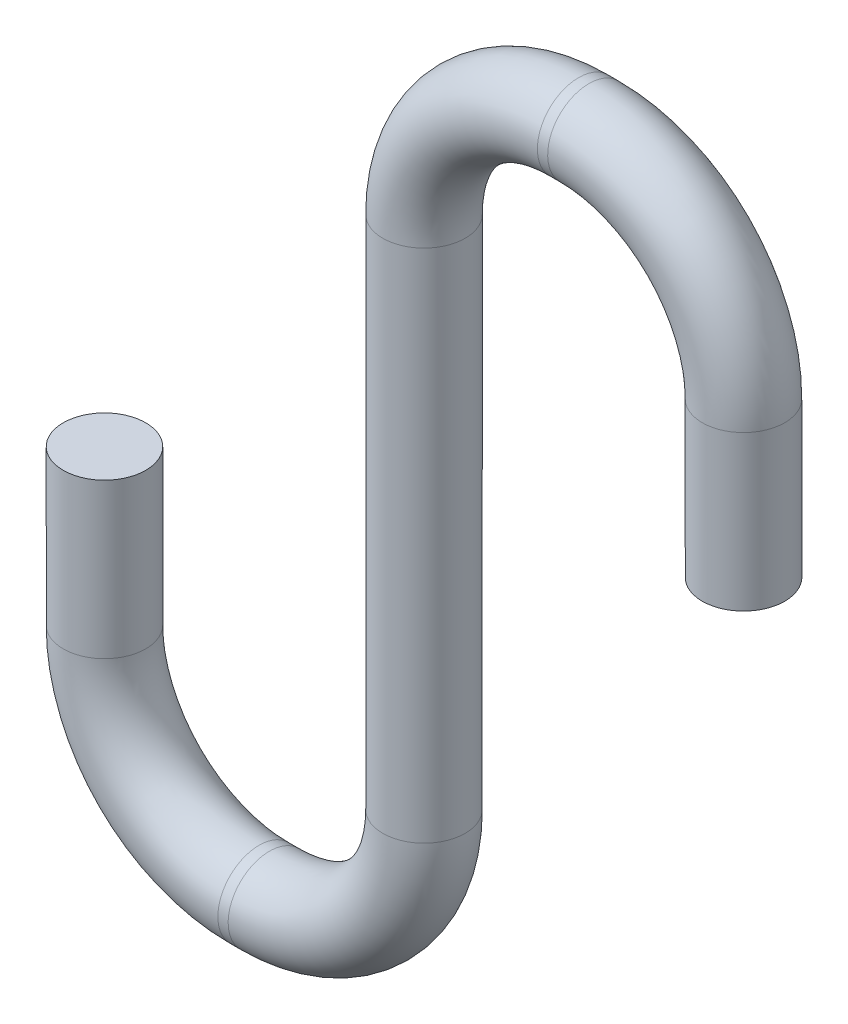
ISO-10303-21;
HEADER;
FILE_DESCRIPTION(('STEP AP214'),'2;1');
FILE_NAME('part.step','',(''),(''),'','','');
FILE_SCHEMA(('AUTOMOTIVE_DESIGN { 1 0 10303 214 1 1 1 1 }'));
ENDSEC;
DATA;
#1=APPLICATION_CONTEXT('core data for automotive mechanical design processes');
#2=APPLICATION_PROTOCOL_DEFINITION('international standard','automotive_design',2000,#1);
#3=PRODUCT_CONTEXT('',#1,'mechanical');
#4=PRODUCT('Part','Part','',(#3));
#5=PRODUCT_RELATED_PRODUCT_CATEGORY('part','',(#4));
#6=PRODUCT_DEFINITION_FORMATION('','',#4);
#7=PRODUCT_DEFINITION_CONTEXT('part definition',#1,'design');
#8=PRODUCT_DEFINITION('design','',#6,#7);
#9=PRODUCT_DEFINITION_SHAPE('','',#8);
#10=(LENGTH_UNIT() NAMED_UNIT(*) SI_UNIT(.MILLI.,.METRE.));
#11=(NAMED_UNIT(*) PLANE_ANGLE_UNIT() SI_UNIT($,.RADIAN.));
#12=(NAMED_UNIT(*) SI_UNIT($,.STERADIAN.) SOLID_ANGLE_UNIT());
#13=UNCERTAINTY_MEASURE_WITH_UNIT(LENGTH_MEASURE(1.E-05),#10,'distance_accuracy_value','');
#14=(GEOMETRIC_REPRESENTATION_CONTEXT(3) GLOBAL_UNCERTAINTY_ASSIGNED_CONTEXT((#13)) GLOBAL_UNIT_ASSIGNED_CONTEXT((#10,
#11,#12)) REPRESENTATION_CONTEXT('',''));
#15=CARTESIAN_POINT('',(0.,0.,0.));
#16=DIRECTION('',(0.,0.,1.));
#17=DIRECTION('',(1.,0.,0.));
#18=AXIS2_PLACEMENT_3D('',#15,#16,#17);
#19=CARTESIAN_POINT('',(-51.6919302261063,-13.8913857677903,0.));
#20=DIRECTION('',(0.,1.,0.));
#21=DIRECTION('',(0.,0.,1.));
#22=AXIS2_PLACEMENT_3D('',#19,#20,#21);
#23=PLANE('',#22);
#24=CARTESIAN_POINT('',(-51.6919302261063,-13.8913857677903,0.));
#25=DIRECTION('',(0.,1.,0.));
#26=DIRECTION('',(0.,0.,1.));
#27=AXIS2_PLACEMENT_3D('',#24,#25,#26);
#28=CIRCLE('',#27,4.);
#29=CARTESIAN_POINT('',(-51.6919302261063,-13.8913857677903,4.));
#30=VERTEX_POINT('',#29);
#31=EDGE_CURVE('E82',#30,#30,#28,.T.);
#32=ORIENTED_EDGE('',*,*,#31,.T.);
#33=EDGE_LOOP('',(#32));
#34=FACE_BOUND('',#33,.T.);
#35=ADVANCED_FACE('F39',(#34),#23,.T.);
#36=CARTESIAN_POINT('',(10.3080697738937,6.10861423220971,0.));
#37=DIRECTION('',(0.,1.,0.));
#38=DIRECTION('',(0.,0.,1.));
#39=AXIS2_PLACEMENT_3D('',#36,#37,#38);
#40=PLANE('',#39);
#41=CARTESIAN_POINT('',(10.3080697738937,6.10861423220971,0.));
#42=DIRECTION('',(0.,1.,0.));
#43=DIRECTION('',(0.,0.,1.));
#44=AXIS2_PLACEMENT_3D('',#41,#42,#43);
#45=CIRCLE('',#44,4.);
#46=CARTESIAN_POINT('',(10.3080697738937,6.10861423220971,4.));
#47=VERTEX_POINT('',#46);
#48=EDGE_CURVE('E10',#47,#47,#45,.T.);
#49=ORIENTED_EDGE('',*,*,#48,.F.);
#50=EDGE_LOOP('',(#49));
#51=FACE_BOUND('',#50,.T.);
#52=ADVANCED_FACE('F91',(#51),#40,.F.);
#53=CARTESIAN_POINT('',(-51.6919302261063,-13.8913857677903,0.));
#54=DIRECTION('',(0.,-1.,0.));
#55=DIRECTION('',(1.,0.,0.));
#56=AXIS2_PLACEMENT_3D('',#53,#54,#55);
#57=CYLINDRICAL_SURFACE('',#56,4.);
#58=CARTESIAN_POINT('',(-51.6919302261062,-28.8913857677903,0.));
#59=DIRECTION('',(0.,1.,0.));
#60=DIRECTION('',(0.,0.,1.));
#61=AXIS2_PLACEMENT_3D('',#58,#59,#60);
#62=CIRCLE('',#61,4.);
#63=CARTESIAN_POINT('',(-55.6919302261062,-28.8913857677903,0.));
#64=VERTEX_POINT('',#63);
#65=EDGE_CURVE('E78',#64,#64,#62,.T.);
#66=ORIENTED_EDGE('',*,*,#65,.T.);
#67=EDGE_LOOP('',(#66));
#68=FACE_BOUND('',#67,.T.);
#69=ORIENTED_EDGE('',*,*,#31,.F.);
#70=EDGE_LOOP('',(#69));
#71=FACE_BOUND('',#70,.T.);
#72=ADVANCED_FACE('F88',(#68,#71),#57,.T.);
#73=CARTESIAN_POINT('',(-36.6919302261063,-28.8913857677903,0.));
#74=DIRECTION('',(0.,0.,1.));
#75=DIRECTION('',(1.,0.,0.));
#76=AXIS2_PLACEMENT_3D('',#73,#74,#75);
#77=TOROIDAL_SURFACE('',#76,15.,4.);
#78=CARTESIAN_POINT('',(-36.6919302261062,-43.8913857677903,0.));
#79=DIRECTION('',(-1.,0.,0.));
#80=DIRECTION('',(0.,0.,1.));
#81=AXIS2_PLACEMENT_3D('',#78,#79,#80);
#82=CIRCLE('',#81,4.);
#83=CARTESIAN_POINT('',(-36.6919302261062,-47.8913857677903,0.));
#84=VERTEX_POINT('',#83);
#85=EDGE_CURVE('E74',#84,#84,#82,.T.);
#86=CARTESIAN_POINT('',(-36.6919302261063,-28.8913857677903,0.));
#87=DIRECTION('',(0.,0.,1.));
#88=DIRECTION('',(1.,0.,0.));
#89=AXIS2_PLACEMENT_3D('',#86,#87,#88);
#90=CIRCLE('',#89,19.);
#91=EDGE_CURVE('',#64,#84,#90,.T.);
#92=ORIENTED_EDGE('',*,*,#65,.F.);
#93=ORIENTED_EDGE('',*,*,#85,.T.);
#94=ORIENTED_EDGE('',*,*,#91,.T.);
#95=ORIENTED_EDGE('',*,*,#91,.F.);
#96=EDGE_LOOP('',(#92,#94,#93,#95));
#97=FACE_BOUND('',#96,.T.);
#98=ADVANCED_FACE('F90',(#97),#77,.T.);
#99=CARTESIAN_POINT('',(-36.6919302261063,-43.8913857677903,0.));
#100=DIRECTION('',(1.,0.,0.));
#101=DIRECTION('',(0.,1.,0.));
#102=AXIS2_PLACEMENT_3D('',#99,#100,#101);
#103=CYLINDRICAL_SURFACE('',#102,4.);
#104=CARTESIAN_POINT('',(-35.6919302261063,-43.8913857677903,0.));
#105=DIRECTION('',(-1.,0.,0.));
#106=DIRECTION('',(0.,0.,1.));
#107=AXIS2_PLACEMENT_3D('',#104,#105,#106);
#108=CIRCLE('',#107,4.);
#109=CARTESIAN_POINT('',(-35.6919302261063,-47.8913857677903,0.));
#110=VERTEX_POINT('',#109);
#111=EDGE_CURVE('E70',#110,#110,#108,.T.);
#112=ORIENTED_EDGE('',*,*,#111,.T.);
#113=EDGE_LOOP('',(#112));
#114=FACE_BOUND('',#113,.T.);
#115=ORIENTED_EDGE('',*,*,#85,.F.);
#116=EDGE_LOOP('',(#115));
#117=FACE_BOUND('',#116,.T.);
#118=ADVANCED_FACE('F98',(#114,#117),#103,.T.);
#119=CARTESIAN_POINT('',(-35.6919302261063,-28.8913857677903,0.));
#120=DIRECTION('',(0.,0.,1.));
#121=DIRECTION('',(1.,0.,0.));
#122=AXIS2_PLACEMENT_3D('',#119,#120,#121);
#123=TOROIDAL_SURFACE('',#122,15.,4.);
#124=CARTESIAN_POINT('',(-20.6919302261062,-28.8913857677903,0.));
#125=DIRECTION('',(0.,-1.,0.));
#126=DIRECTION('',(0.,0.,1.));
#127=AXIS2_PLACEMENT_3D('',#124,#125,#126);
#128=CIRCLE('',#127,4.);
#129=CARTESIAN_POINT('',(-16.6919302261062,-28.8913857677903,0.));
#130=VERTEX_POINT('',#129);
#131=EDGE_CURVE('E66',#130,#130,#128,.T.);
#132=CARTESIAN_POINT('',(-35.6919302261063,-28.8913857677903,0.));
#133=DIRECTION('',(0.,0.,1.));
#134=DIRECTION('',(1.,0.,0.));
#135=AXIS2_PLACEMENT_3D('',#132,#133,#134);
#136=CIRCLE('',#135,19.);
#137=EDGE_CURVE('',#110,#130,#136,.T.);
#138=ORIENTED_EDGE('',*,*,#111,.F.);
#139=ORIENTED_EDGE('',*,*,#131,.T.);
#140=ORIENTED_EDGE('',*,*,#137,.T.);
#141=ORIENTED_EDGE('',*,*,#137,.F.);
#142=EDGE_LOOP('',(#138,#140,#139,#141));
#143=FACE_BOUND('',#142,.T.);
#144=ADVANCED_FACE('F123',(#143),#123,.T.);
#145=CARTESIAN_POINT('',(-20.6919302261063,-28.8913857677903,0.));
#146=DIRECTION('',(0.,1.,0.));
#147=DIRECTION('',(0.,0.,1.));
#148=AXIS2_PLACEMENT_3D('',#145,#146,#147);
#149=CYLINDRICAL_SURFACE('',#148,4.);
#150=CARTESIAN_POINT('',(-20.6919302261063,21.1086142322096,0.));
#151=DIRECTION('',(0.,-1.,0.));
#152=DIRECTION('',(0.,0.,1.));
#153=AXIS2_PLACEMENT_3D('',#150,#151,#152);
#154=CIRCLE('',#153,4.);
#155=CARTESIAN_POINT('',(-24.6919302261063,21.1086142322096,0.));
#156=VERTEX_POINT('',#155);
#157=EDGE_CURVE('E62',#156,#156,#154,.T.);
#158=ORIENTED_EDGE('',*,*,#157,.T.);
#159=EDGE_LOOP('',(#158));
#160=FACE_BOUND('',#159,.T.);
#161=ORIENTED_EDGE('',*,*,#131,.F.);
#162=EDGE_LOOP('',(#161));
#163=FACE_BOUND('',#162,.T.);
#164=ADVANCED_FACE('F119',(#160,#163),#149,.T.);
#165=CARTESIAN_POINT('',(-5.69193022610626,21.1086142322097,0.));
#166=DIRECTION('',(0.,0.,-1.));
#167=DIRECTION('',(-1.,0.,0.));
#168=AXIS2_PLACEMENT_3D('',#165,#166,#167);
#169=TOROIDAL_SURFACE('',#168,15.,4.);
#170=CARTESIAN_POINT('',(-5.69193022610615,36.1086142322097,0.));
#171=DIRECTION('',(-1.,0.,0.));
#172=DIRECTION('',(0.,0.,1.));
#173=AXIS2_PLACEMENT_3D('',#170,#171,#172);
#174=CIRCLE('',#173,4.);
#175=CARTESIAN_POINT('',(-5.69193022610612,40.1086142322097,0.));
#176=VERTEX_POINT('',#175);
#177=EDGE_CURVE('E56',#176,#176,#174,.T.);
#178=CARTESIAN_POINT('',(-5.69193022610626,21.1086142322097,0.));
#179=DIRECTION('',(0.,0.,-1.));
#180=DIRECTION('',(-1.,0.,0.));
#181=AXIS2_PLACEMENT_3D('',#178,#179,#180);
#182=CIRCLE('',#181,19.);
#183=EDGE_CURVE('',#156,#176,#182,.T.);
#184=ORIENTED_EDGE('',*,*,#157,.F.);
#185=ORIENTED_EDGE('',*,*,#177,.T.);
#186=ORIENTED_EDGE('',*,*,#183,.T.);
#187=ORIENTED_EDGE('',*,*,#183,.F.);
#188=EDGE_LOOP('',(#184,#186,#185,#187));
#189=FACE_BOUND('',#188,.T.);
#190=ADVANCED_FACE('F115',(#189),#169,.T.);
#191=CARTESIAN_POINT('',(-5.69193022610615,36.1086142322097,0.));
#192=DIRECTION('',(1.,0.,0.));
#193=DIRECTION('',(0.,0.,-1.));
#194=AXIS2_PLACEMENT_3D('',#191,#192,#193);
#195=CYLINDRICAL_SURFACE('',#194,4.);
#196=CARTESIAN_POINT('',(-4.69193022610636,36.1086142322097,0.));
#197=DIRECTION('',(-1.,0.,0.));
#198=DIRECTION('',(0.,0.,1.));
#199=AXIS2_PLACEMENT_3D('',#196,#197,#198);
#200=CIRCLE('',#199,4.);
#201=CARTESIAN_POINT('',(-4.69193022610638,40.1086142322097,0.));
#202=VERTEX_POINT('',#201);
#203=EDGE_CURVE('E51',#202,#202,#200,.T.);
#204=ORIENTED_EDGE('',*,*,#203,.T.);
#205=EDGE_LOOP('',(#204));
#206=FACE_BOUND('',#205,.T.);
#207=ORIENTED_EDGE('',*,*,#177,.F.);
#208=EDGE_LOOP('',(#207));
#209=FACE_BOUND('',#208,.T.);
#210=ADVANCED_FACE('F109',(#206,#209),#195,.T.);
#211=CARTESIAN_POINT('',(-4.69193022610625,21.1086142322097,0.));
#212=DIRECTION('',(0.,0.,-1.));
#213=DIRECTION('',(-1.,0.,0.));
#214=AXIS2_PLACEMENT_3D('',#211,#212,#213);
#215=TOROIDAL_SURFACE('',#214,15.,4.);
#216=CARTESIAN_POINT('',(10.3080697738937,21.1086142322097,0.));
#217=DIRECTION('',(0.,1.,0.));
#218=DIRECTION('',(0.,0.,1.));
#219=AXIS2_PLACEMENT_3D('',#216,#217,#218);
#220=CIRCLE('',#219,4.);
#221=CARTESIAN_POINT('',(14.3080697738937,21.1086142322097,0.));
#222=VERTEX_POINT('',#221);
#223=EDGE_CURVE('E46',#222,#222,#220,.T.);
#224=CARTESIAN_POINT('',(-4.69193022610625,21.1086142322097,0.));
#225=DIRECTION('',(0.,0.,-1.));
#226=DIRECTION('',(-1.,0.,0.));
#227=AXIS2_PLACEMENT_3D('',#224,#225,#226);
#228=CIRCLE('',#227,19.);
#229=EDGE_CURVE('',#202,#222,#228,.T.);
#230=ORIENTED_EDGE('',*,*,#203,.F.);
#231=ORIENTED_EDGE('',*,*,#223,.T.);
#232=ORIENTED_EDGE('',*,*,#229,.T.);
#233=ORIENTED_EDGE('',*,*,#229,.F.);
#234=EDGE_LOOP('',(#230,#232,#231,#233));
#235=FACE_BOUND('',#234,.T.);
#236=ADVANCED_FACE('F104',(#235),#215,.T.);
#237=CARTESIAN_POINT('',(10.3080697738937,21.1086142322096,0.));
#238=DIRECTION('',(0.,-1.,0.));
#239=DIRECTION('',(0.,0.,-1.));
#240=AXIS2_PLACEMENT_3D('',#237,#238,#239);
#241=CYLINDRICAL_SURFACE('',#240,4.);
#242=ORIENTED_EDGE('',*,*,#48,.T.);
#243=EDGE_LOOP('',(#242));
#244=FACE_BOUND('',#243,.T.);
#245=ORIENTED_EDGE('',*,*,#223,.F.);
#246=EDGE_LOOP('',(#245));
#247=FACE_BOUND('',#246,.T.);
#248=ADVANCED_FACE('F102',(#244,#247),#241,.T.);
#249=CLOSED_SHELL('',(#35,#52,#72,#98,#118,#144,#164,#190,#210,#236,#248));
#250=MANIFOLD_SOLID_BREP('B2',#249);
#251=ADVANCED_BREP_SHAPE_REPRESENTATION('',(#18,#250),#14);
#252=SHAPE_DEFINITION_REPRESENTATION(#9,#251);
ENDSEC;
END-ISO-10303-21;
